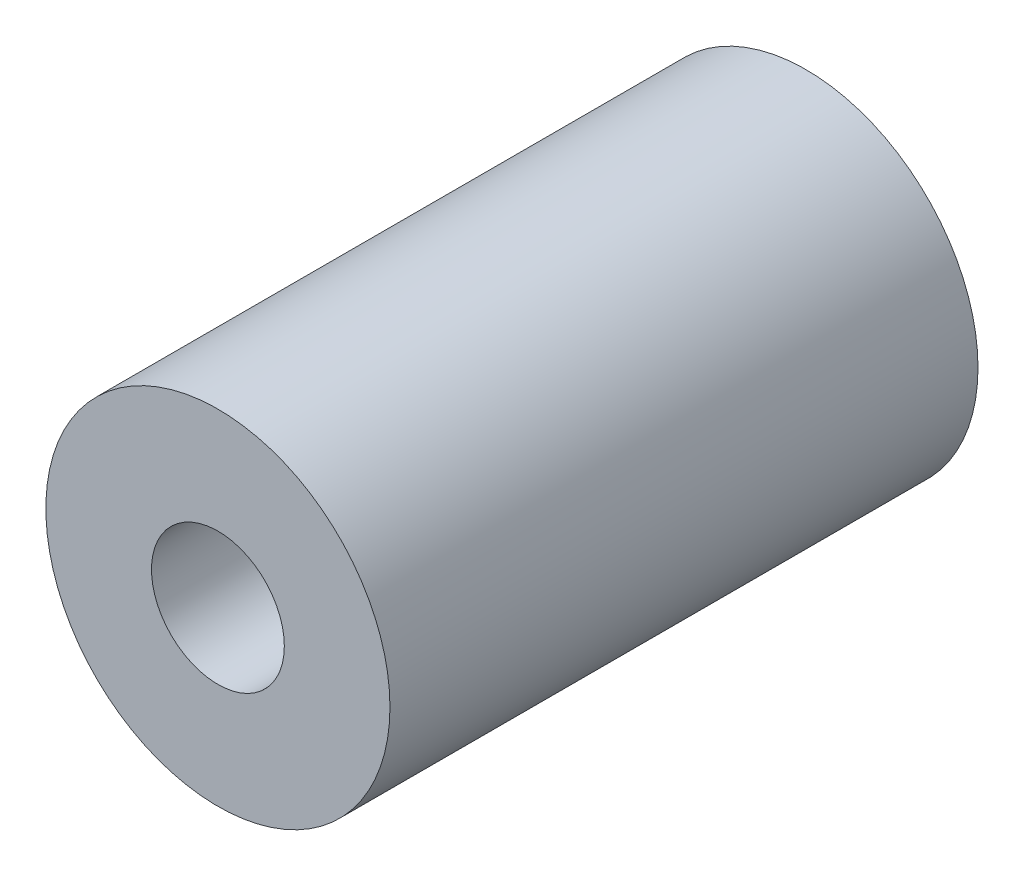
ISO-10303-21;
HEADER;
FILE_DESCRIPTION(('STEP AP214'),'2;1');
FILE_NAME('part.step','',(''),(''),'','','');
FILE_SCHEMA(('AUTOMOTIVE_DESIGN { 1 0 10303 214 1 1 1 1 }'));
ENDSEC;
DATA;
#1=APPLICATION_CONTEXT('core data for automotive mechanical design processes');
#2=APPLICATION_PROTOCOL_DEFINITION('international standard','automotive_design',2000,#1);
#3=PRODUCT_CONTEXT('',#1,'mechanical');
#4=PRODUCT('Part','Part','',(#3));
#5=PRODUCT_RELATED_PRODUCT_CATEGORY('part','',(#4));
#6=PRODUCT_DEFINITION_FORMATION('','',#4);
#7=PRODUCT_DEFINITION_CONTEXT('part definition',#1,'design');
#8=PRODUCT_DEFINITION('design','',#6,#7);
#9=PRODUCT_DEFINITION_SHAPE('','',#8);
#10=(LENGTH_UNIT() NAMED_UNIT(*) SI_UNIT(.MILLI.,.METRE.));
#11=(NAMED_UNIT(*) PLANE_ANGLE_UNIT() SI_UNIT($,.RADIAN.));
#12=(NAMED_UNIT(*) SI_UNIT($,.STERADIAN.) SOLID_ANGLE_UNIT());
#13=UNCERTAINTY_MEASURE_WITH_UNIT(LENGTH_MEASURE(1.E-05),#10,'distance_accuracy_value','');
#14=(GEOMETRIC_REPRESENTATION_CONTEXT(3) GLOBAL_UNCERTAINTY_ASSIGNED_CONTEXT((#13)) GLOBAL_UNIT_ASSIGNED_CONTEXT((#10,
#11,#12)) REPRESENTATION_CONTEXT('',''));
#15=CARTESIAN_POINT('',(0.,0.,0.));
#16=DIRECTION('',(0.,0.,1.));
#17=DIRECTION('',(1.,0.,0.));
#18=AXIS2_PLACEMENT_3D('',#15,#16,#17);
#19=CARTESIAN_POINT('',(0.,0.,6.75));
#20=DIRECTION('',(0.,0.,1.));
#21=DIRECTION('',(1.,0.,0.));
#22=AXIS2_PLACEMENT_3D('',#19,#20,#21);
#23=PLANE('',#22);
#24=CARTESIAN_POINT('',(0.,0.,6.75));
#25=DIRECTION('',(0.,0.,1.));
#26=DIRECTION('',(1.,0.,0.));
#27=AXIS2_PLACEMENT_3D('',#24,#25,#26);
#28=CIRCLE('',#27,3.95);
#29=CARTESIAN_POINT('',(3.95,0.,6.75));
#30=VERTEX_POINT('',#29);
#31=EDGE_CURVE('E10',#30,#30,#28,.T.);
#32=ORIENTED_EDGE('',*,*,#31,.T.);
#33=EDGE_LOOP('',(#32));
#34=FACE_BOUND('',#33,.T.);
#35=CARTESIAN_POINT('',(0.,0.,6.75));
#36=DIRECTION('',(0.,0.,1.));
#37=DIRECTION('',(1.,0.,0.));
#38=AXIS2_PLACEMENT_3D('',#35,#36,#37);
#39=CIRCLE('',#38,1.525);
#40=CARTESIAN_POINT('',(1.525,0.,6.75));
#41=VERTEX_POINT('',#40);
#42=EDGE_CURVE('E50',#41,#41,#39,.T.);
#43=ORIENTED_EDGE('',*,*,#42,.F.);
#44=EDGE_LOOP('',(#43));
#45=FACE_BOUND('',#44,.T.);
#46=ADVANCED_FACE('F37',(#34,#45),#23,.T.);
#47=CARTESIAN_POINT('',(0.,0.,-6.75));
#48=DIRECTION('',(0.,0.,1.));
#49=DIRECTION('',(1.,0.,0.));
#50=AXIS2_PLACEMENT_3D('',#47,#48,#49);
#51=PLANE('',#50);
#52=CARTESIAN_POINT('',(0.,0.,-6.75));
#53=DIRECTION('',(0.,0.,1.));
#54=DIRECTION('',(1.,0.,0.));
#55=AXIS2_PLACEMENT_3D('',#52,#53,#54);
#56=CIRCLE('',#55,3.95);
#57=CARTESIAN_POINT('',(3.95,0.,-6.75));
#58=VERTEX_POINT('',#57);
#59=EDGE_CURVE('E41',#58,#58,#56,.T.);
#60=ORIENTED_EDGE('',*,*,#59,.F.);
#61=EDGE_LOOP('',(#60));
#62=FACE_BOUND('',#61,.T.);
#63=CARTESIAN_POINT('',(0.,0.,-6.75));
#64=DIRECTION('',(0.,0.,1.));
#65=DIRECTION('',(1.,0.,0.));
#66=AXIS2_PLACEMENT_3D('',#63,#64,#65);
#67=CIRCLE('',#66,1.525);
#68=CARTESIAN_POINT('',(1.525,0.,-6.75));
#69=VERTEX_POINT('',#68);
#70=EDGE_CURVE('E52',#69,#69,#67,.T.);
#71=ORIENTED_EDGE('',*,*,#70,.T.);
#72=EDGE_LOOP('',(#71));
#73=FACE_BOUND('',#72,.T.);
#74=ADVANCED_FACE('F64',(#62,#73),#51,.F.);
#75=CARTESIAN_POINT('',(0.,0.,6.75));
#76=DIRECTION('',(0.,0.,-1.));
#77=DIRECTION('',(-1.,0.,0.));
#78=AXIS2_PLACEMENT_3D('',#75,#76,#77);
#79=CYLINDRICAL_SURFACE('',#78,3.95);
#80=ORIENTED_EDGE('',*,*,#31,.F.);
#81=EDGE_LOOP('',(#80));
#82=FACE_BOUND('',#81,.T.);
#83=ORIENTED_EDGE('',*,*,#59,.T.);
#84=EDGE_LOOP('',(#83));
#85=FACE_BOUND('',#84,.T.);
#86=ADVANCED_FACE('F39',(#82,#85),#79,.T.);
#87=CARTESIAN_POINT('',(0.,0.,6.75));
#88=DIRECTION('',(0.,0.,-1.));
#89=DIRECTION('',(-1.,0.,0.));
#90=AXIS2_PLACEMENT_3D('',#87,#88,#89);
#91=CYLINDRICAL_SURFACE('',#90,1.525);
#92=ORIENTED_EDGE('',*,*,#42,.T.);
#93=EDGE_LOOP('',(#92));
#94=FACE_BOUND('',#93,.T.);
#95=ORIENTED_EDGE('',*,*,#70,.F.);
#96=EDGE_LOOP('',(#95));
#97=FACE_BOUND('',#96,.T.);
#98=ADVANCED_FACE('F60',(#94,#97),#91,.F.);
#99=CLOSED_SHELL('',(#46,#74,#86,#98));
#100=MANIFOLD_SOLID_BREP('B2',#99);
#101=ADVANCED_BREP_SHAPE_REPRESENTATION('',(#18,#100),#14);
#102=SHAPE_DEFINITION_REPRESENTATION(#9,#101);
ENDSEC;
END-ISO-10303-21;
